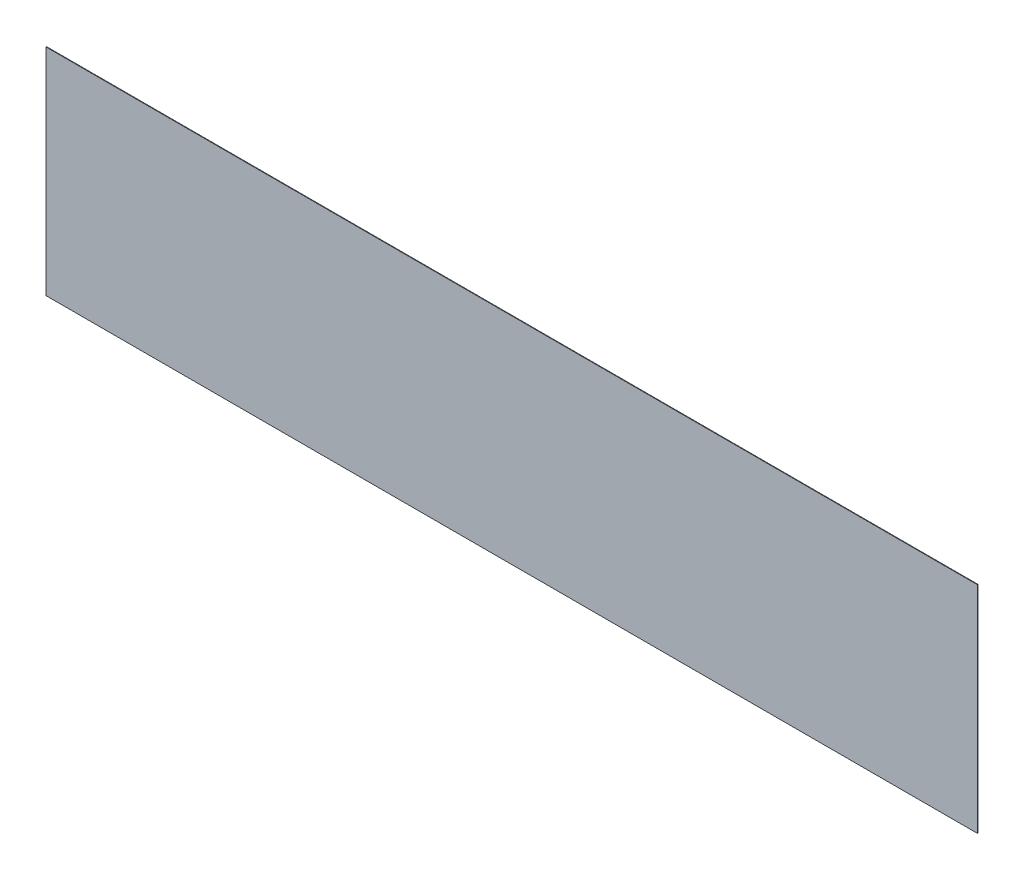
ISO-10303-21;
HEADER;
FILE_DESCRIPTION(('STEP AP214'),'2;1');
FILE_NAME('part.step','',(''),(''),'','','');
FILE_SCHEMA(('AUTOMOTIVE_DESIGN { 1 0 10303 214 1 1 1 1 }'));
ENDSEC;
DATA;
#1=APPLICATION_CONTEXT('core data for automotive mechanical design processes');
#2=APPLICATION_PROTOCOL_DEFINITION('international standard','automotive_design',2000,#1);
#3=PRODUCT_CONTEXT('',#1,'mechanical');
#4=PRODUCT('Part','Part','',(#3));
#5=PRODUCT_RELATED_PRODUCT_CATEGORY('part','',(#4));
#6=PRODUCT_DEFINITION_FORMATION('','',#4);
#7=PRODUCT_DEFINITION_CONTEXT('part definition',#1,'design');
#8=PRODUCT_DEFINITION('design','',#6,#7);
#9=PRODUCT_DEFINITION_SHAPE('','',#8);
#10=(LENGTH_UNIT() NAMED_UNIT(*) SI_UNIT(.MILLI.,.METRE.));
#11=(NAMED_UNIT(*) PLANE_ANGLE_UNIT() SI_UNIT($,.RADIAN.));
#12=(NAMED_UNIT(*) SI_UNIT($,.STERADIAN.) SOLID_ANGLE_UNIT());
#13=UNCERTAINTY_MEASURE_WITH_UNIT(LENGTH_MEASURE(1.E-05),#10,'distance_accuracy_value','');
#14=(GEOMETRIC_REPRESENTATION_CONTEXT(3) GLOBAL_UNCERTAINTY_ASSIGNED_CONTEXT((#13)) GLOBAL_UNIT_ASSIGNED_CONTEXT((#10,
#11,#12)) REPRESENTATION_CONTEXT('',''));
#15=CARTESIAN_POINT('',(0.,0.,0.));
#16=DIRECTION('',(0.,0.,1.));
#17=DIRECTION('',(1.,0.,0.));
#18=AXIS2_PLACEMENT_3D('',#15,#16,#17);
#19=CARTESIAN_POINT('',(0.,1.269999991408E-06,0.00100076));
#20=DIRECTION('',(0.,0.,1.));
#21=DIRECTION('',(1.,0.,0.));
#22=AXIS2_PLACEMENT_3D('',#19,#20,#21);
#23=PLANE('',#22);
#24=DIRECTION('',(-1.,0.,0.));
#25=VECTOR('',#24,1.);
#26=CARTESIAN_POINT('',(0.80000094,0.1850009,0.00100076));
#27=LINE('',#26,#25);
#28=CARTESIAN_POINT('',(0.80000094,0.1850009,0.00100076));
#29=VERTEX_POINT('',#28);
#30=CARTESIAN_POINT('',(-0.80000094,0.1850009,0.00100076));
#31=VERTEX_POINT('',#30);
#32=EDGE_CURVE('E95',#29,#31,#27,.T.);
#33=ORIENTED_EDGE('',*,*,#32,.T.);
#34=DIRECTION('',(0.,-1.,0.));
#35=VECTOR('',#34,1.);
#36=CARTESIAN_POINT('',(-0.80000094,0.1850009,0.00100076));
#37=LINE('',#36,#35);
#38=CARTESIAN_POINT('',(-0.80000094,-0.18499836,0.00100076));
#39=VERTEX_POINT('',#38);
#40=EDGE_CURVE('E74',#31,#39,#37,.T.);
#41=ORIENTED_EDGE('',*,*,#40,.T.);
#42=DIRECTION('',(1.,0.,0.));
#43=VECTOR('',#42,1.);
#44=CARTESIAN_POINT('',(-0.80000094,-0.18499836,0.00100076));
#45=LINE('',#44,#43);
#46=CARTESIAN_POINT('',(0.80000094,-0.18499836,0.00100076));
#47=VERTEX_POINT('',#46);
#48=EDGE_CURVE('E78',#39,#47,#45,.T.);
#49=ORIENTED_EDGE('',*,*,#48,.T.);
#50=DIRECTION('',(0.,1.,0.));
#51=VECTOR('',#50,1.);
#52=CARTESIAN_POINT('',(0.80000094,-0.18499836,0.00100076));
#53=LINE('',#52,#51);
#54=EDGE_CURVE('E11',#47,#29,#53,.T.);
#55=ORIENTED_EDGE('',*,*,#54,.T.);
#56=EDGE_LOOP('',(#33,#41,#49,#55));
#57=FACE_BOUND('',#56,.T.);
#58=ADVANCED_FACE('F16',(#57),#23,.T.);
#59=CARTESIAN_POINT('',(0.,1.269999991408E-06,0.));
#60=DIRECTION('',(0.,0.,1.));
#61=DIRECTION('',(1.,0.,0.));
#62=AXIS2_PLACEMENT_3D('',#59,#60,#61);
#63=PLANE('',#62);
#64=DIRECTION('',(0.,1.,0.));
#65=VECTOR('',#64,1.);
#66=CARTESIAN_POINT('',(0.80000094,-0.18499836,0.));
#67=LINE('',#66,#65);
#68=CARTESIAN_POINT('',(0.80000094,-0.18499836,0.));
#69=VERTEX_POINT('',#68);
#70=CARTESIAN_POINT('',(0.80000094,0.1850009,0.));
#71=VERTEX_POINT('',#70);
#72=EDGE_CURVE('E26',#69,#71,#67,.T.);
#73=ORIENTED_EDGE('',*,*,#72,.F.);
#74=DIRECTION('',(1.,0.,0.));
#75=VECTOR('',#74,1.);
#76=CARTESIAN_POINT('',(-0.80000094,-0.18499836,0.));
#77=LINE('',#76,#75);
#78=CARTESIAN_POINT('',(-0.80000094,-0.18499836,0.));
#79=VERTEX_POINT('',#78);
#80=EDGE_CURVE('E19',#79,#69,#77,.T.);
#81=ORIENTED_EDGE('',*,*,#80,.F.);
#82=DIRECTION('',(0.,-1.,0.));
#83=VECTOR('',#82,1.);
#84=CARTESIAN_POINT('',(-0.80000094,0.1850009,0.));
#85=LINE('',#84,#83);
#86=CARTESIAN_POINT('',(-0.80000094,0.1850009,0.));
#87=VERTEX_POINT('',#86);
#88=EDGE_CURVE('E68',#87,#79,#85,.T.);
#89=ORIENTED_EDGE('',*,*,#88,.F.);
#90=DIRECTION('',(-1.,0.,0.));
#91=VECTOR('',#90,1.);
#92=CARTESIAN_POINT('',(0.80000094,0.1850009,0.));
#93=LINE('',#92,#91);
#94=EDGE_CURVE('E112',#71,#87,#93,.T.);
#95=ORIENTED_EDGE('',*,*,#94,.F.);
#96=EDGE_LOOP('',(#73,#81,#89,#95));
#97=FACE_BOUND('',#96,.T.);
#98=ADVANCED_FACE('F65',(#97),#63,.F.);
#99=CARTESIAN_POINT('',(0.80000094,-0.18499836,0.));
#100=DIRECTION('',(-1.,0.,0.));
#101=DIRECTION('',(0.,0.,1.));
#102=AXIS2_PLACEMENT_3D('',#99,#100,#101);
#103=PLANE('',#102);
#104=ORIENTED_EDGE('',*,*,#72,.T.);
#105=DIRECTION('',(0.,0.,1.));
#106=VECTOR('',#105,1.);
#107=CARTESIAN_POINT('',(0.80000094,0.1850009,0.));
#108=LINE('',#107,#106);
#109=EDGE_CURVE('E89',#71,#29,#108,.T.);
#110=ORIENTED_EDGE('',*,*,#109,.T.);
#111=ORIENTED_EDGE('',*,*,#54,.F.);
#112=DIRECTION('',(0.,0.,1.));
#113=VECTOR('',#112,1.);
#114=CARTESIAN_POINT('',(0.80000094,-0.18499836,0.));
#115=LINE('',#114,#113);
#116=EDGE_CURVE('E73',#69,#47,#115,.T.);
#117=ORIENTED_EDGE('',*,*,#116,.F.);
#118=EDGE_LOOP('',(#104,#110,#111,#117));
#119=FACE_BOUND('',#118,.T.);
#120=ADVANCED_FACE('F107',(#119),#103,.F.);
#121=CARTESIAN_POINT('',(-0.80000094,-0.18499836,0.));
#122=DIRECTION('',(0.,1.,0.));
#123=DIRECTION('',(1.,0.,0.));
#124=AXIS2_PLACEMENT_3D('',#121,#122,#123);
#125=PLANE('',#124);
#126=ORIENTED_EDGE('',*,*,#80,.T.);
#127=ORIENTED_EDGE('',*,*,#116,.T.);
#128=ORIENTED_EDGE('',*,*,#48,.F.);
#129=DIRECTION('',(0.,0.,1.));
#130=VECTOR('',#129,1.);
#131=CARTESIAN_POINT('',(-0.80000094,-0.18499836,0.));
#132=LINE('',#131,#130);
#133=EDGE_CURVE('E76',#79,#39,#132,.T.);
#134=ORIENTED_EDGE('',*,*,#133,.F.);
#135=EDGE_LOOP('',(#126,#127,#128,#134));
#136=FACE_BOUND('',#135,.T.);
#137=ADVANCED_FACE('F77',(#136),#125,.F.);
#138=CARTESIAN_POINT('',(-0.80000094,0.1850009,0.));
#139=DIRECTION('',(1.,0.,0.));
#140=DIRECTION('',(0.,1.,0.));
#141=AXIS2_PLACEMENT_3D('',#138,#139,#140);
#142=PLANE('',#141);
#143=ORIENTED_EDGE('',*,*,#88,.T.);
#144=ORIENTED_EDGE('',*,*,#133,.T.);
#145=ORIENTED_EDGE('',*,*,#40,.F.);
#146=DIRECTION('',(0.,0.,1.));
#147=VECTOR('',#146,1.);
#148=CARTESIAN_POINT('',(-0.80000094,0.1850009,0.));
#149=LINE('',#148,#147);
#150=EDGE_CURVE('E86',#87,#31,#149,.T.);
#151=ORIENTED_EDGE('',*,*,#150,.F.);
#152=EDGE_LOOP('',(#143,#144,#145,#151));
#153=FACE_BOUND('',#152,.T.);
#154=ADVANCED_FACE('F84',(#153),#142,.F.);
#155=CARTESIAN_POINT('',(0.80000094,0.1850009,0.));
#156=DIRECTION('',(0.,-1.,0.));
#157=DIRECTION('',(0.,0.,-1.));
#158=AXIS2_PLACEMENT_3D('',#155,#156,#157);
#159=PLANE('',#158);
#160=ORIENTED_EDGE('',*,*,#94,.T.);
#161=ORIENTED_EDGE('',*,*,#150,.T.);
#162=ORIENTED_EDGE('',*,*,#32,.F.);
#163=ORIENTED_EDGE('',*,*,#109,.F.);
#164=EDGE_LOOP('',(#160,#161,#162,#163));
#165=FACE_BOUND('',#164,.T.);
#166=ADVANCED_FACE('F111',(#165),#159,.F.);
#167=CLOSED_SHELL('',(#58,#98,#120,#137,#154,#166));
#168=MANIFOLD_SOLID_BREP('B1',#167);
#169=ADVANCED_BREP_SHAPE_REPRESENTATION('',(#18,#168),#14);
#170=SHAPE_DEFINITION_REPRESENTATION(#9,#169);
ENDSEC;
END-ISO-10303-21;
